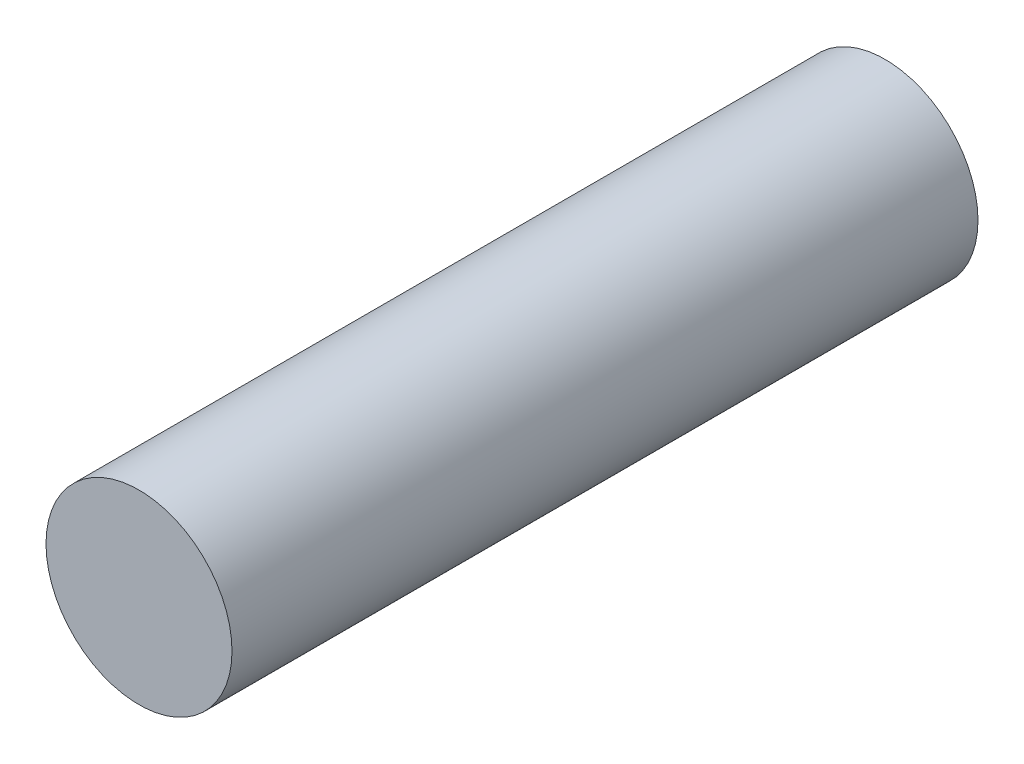
ISO-10303-21;
HEADER;
FILE_DESCRIPTION(('STEP AP214'),'2;1');
FILE_NAME('part.step','',(''),(''),'','','');
FILE_SCHEMA(('AUTOMOTIVE_DESIGN { 1 0 10303 214 1 1 1 1 }'));
ENDSEC;
DATA;
#1=APPLICATION_CONTEXT('core data for automotive mechanical design processes');
#2=APPLICATION_PROTOCOL_DEFINITION('international standard','automotive_design',2000,#1);
#3=PRODUCT_CONTEXT('',#1,'mechanical');
#4=PRODUCT('Part','Part','',(#3));
#5=PRODUCT_RELATED_PRODUCT_CATEGORY('part','',(#4));
#6=PRODUCT_DEFINITION_FORMATION('','',#4);
#7=PRODUCT_DEFINITION_CONTEXT('part definition',#1,'design');
#8=PRODUCT_DEFINITION('design','',#6,#7);
#9=PRODUCT_DEFINITION_SHAPE('','',#8);
#10=(LENGTH_UNIT() NAMED_UNIT(*) SI_UNIT(.MILLI.,.METRE.));
#11=(NAMED_UNIT(*) PLANE_ANGLE_UNIT() SI_UNIT($,.RADIAN.));
#12=(NAMED_UNIT(*) SI_UNIT($,.STERADIAN.) SOLID_ANGLE_UNIT());
#13=UNCERTAINTY_MEASURE_WITH_UNIT(LENGTH_MEASURE(1.E-05),#10,'distance_accuracy_value','');
#14=(GEOMETRIC_REPRESENTATION_CONTEXT(3) GLOBAL_UNCERTAINTY_ASSIGNED_CONTEXT((#13)) GLOBAL_UNIT_ASSIGNED_CONTEXT((#10,
#11,#12)) REPRESENTATION_CONTEXT('',''));
#15=CARTESIAN_POINT('',(0.,0.,0.));
#16=DIRECTION('',(0.,0.,1.));
#17=DIRECTION('',(1.,0.,0.));
#18=AXIS2_PLACEMENT_3D('',#15,#16,#17);
#19=CARTESIAN_POINT('',(0.,0.,0.75));
#20=DIRECTION('',(0.,0.,-1.));
#21=DIRECTION('',(-1.,0.,0.));
#22=AXIS2_PLACEMENT_3D('',#19,#20,#21);
#23=CYLINDRICAL_SURFACE('',#22,0.0935);
#24=CARTESIAN_POINT('',(0.,0.,0.75));
#25=DIRECTION('',(0.,0.,1.));
#26=DIRECTION('',(1.,0.,0.));
#27=AXIS2_PLACEMENT_3D('',#24,#25,#26);
#28=CIRCLE('',#27,0.0935);
#29=CARTESIAN_POINT('',(0.0935,0.,0.75));
#30=VERTEX_POINT('',#29);
#31=EDGE_CURVE('E10',#30,#30,#28,.T.);
#32=ORIENTED_EDGE('',*,*,#31,.F.);
#33=EDGE_LOOP('',(#32));
#34=FACE_BOUND('',#33,.T.);
#35=CARTESIAN_POINT('',(0.,0.,0.));
#36=DIRECTION('',(0.,0.,1.));
#37=DIRECTION('',(1.,0.,0.));
#38=AXIS2_PLACEMENT_3D('',#35,#36,#37);
#39=CIRCLE('',#38,0.0935);
#40=CARTESIAN_POINT('',(0.0935,0.,0.));
#41=VERTEX_POINT('',#40);
#42=EDGE_CURVE('E40',#41,#41,#39,.T.);
#43=ORIENTED_EDGE('',*,*,#42,.T.);
#44=EDGE_LOOP('',(#43));
#45=FACE_BOUND('',#44,.T.);
#46=ADVANCED_FACE('F37',(#34,#45),#23,.T.);
#47=CARTESIAN_POINT('',(0.,0.,0.75));
#48=DIRECTION('',(0.,0.,1.));
#49=DIRECTION('',(1.,0.,0.));
#50=AXIS2_PLACEMENT_3D('',#47,#48,#49);
#51=PLANE('',#50);
#52=ORIENTED_EDGE('',*,*,#31,.T.);
#53=EDGE_LOOP('',(#52));
#54=FACE_BOUND('',#53,.T.);
#55=ADVANCED_FACE('F54',(#54),#51,.T.);
#56=CARTESIAN_POINT('',(0.,0.,0.));
#57=DIRECTION('',(0.,0.,1.));
#58=DIRECTION('',(1.,0.,0.));
#59=AXIS2_PLACEMENT_3D('',#56,#57,#58);
#60=PLANE('',#59);
#61=ORIENTED_EDGE('',*,*,#42,.F.);
#62=EDGE_LOOP('',(#61));
#63=FACE_BOUND('',#62,.T.);
#64=ADVANCED_FACE('F52',(#63),#60,.F.);
#65=CLOSED_SHELL('',(#46,#55,#64));
#66=MANIFOLD_SOLID_BREP('B2',#65);
#67=ADVANCED_BREP_SHAPE_REPRESENTATION('',(#18,#66),#14);
#68=SHAPE_DEFINITION_REPRESENTATION(#9,#67);
ENDSEC;
END-ISO-10303-21;
